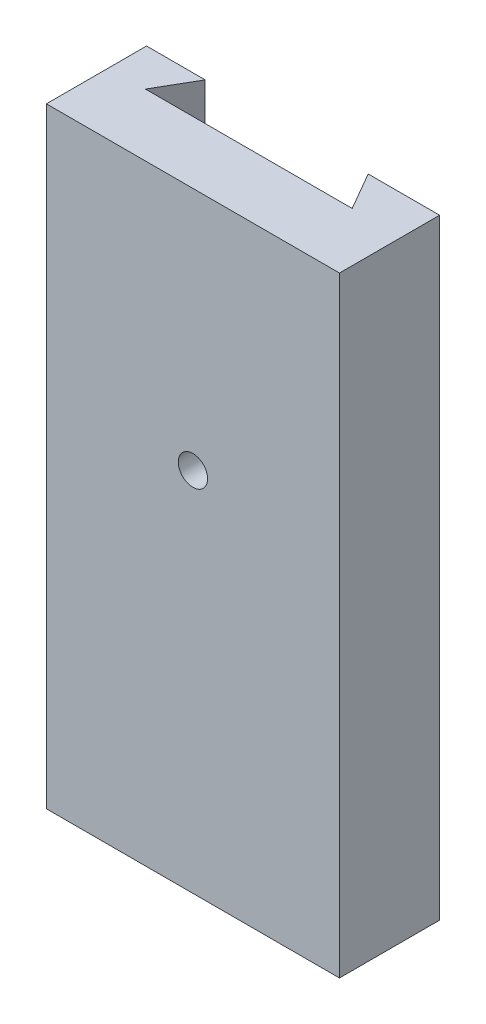
ISO-10303-21;
HEADER;
FILE_DESCRIPTION(('STEP AP214'),'2;1');
FILE_NAME('part.step','',(''),(''),'','','');
FILE_SCHEMA(('AUTOMOTIVE_DESIGN { 1 0 10303 214 1 1 1 1 }'));
ENDSEC;
DATA;
#1=APPLICATION_CONTEXT('core data for automotive mechanical design processes');
#2=APPLICATION_PROTOCOL_DEFINITION('international standard','automotive_design',2000,#1);
#3=PRODUCT_CONTEXT('',#1,'mechanical');
#4=PRODUCT('Part','Part','',(#3));
#5=PRODUCT_RELATED_PRODUCT_CATEGORY('part','',(#4));
#6=PRODUCT_DEFINITION_FORMATION('','',#4);
#7=PRODUCT_DEFINITION_CONTEXT('part definition',#1,'design');
#8=PRODUCT_DEFINITION('design','',#6,#7);
#9=PRODUCT_DEFINITION_SHAPE('','',#8);
#10=(LENGTH_UNIT() NAMED_UNIT(*) SI_UNIT(.MILLI.,.METRE.));
#11=(NAMED_UNIT(*) PLANE_ANGLE_UNIT() SI_UNIT($,.RADIAN.));
#12=(NAMED_UNIT(*) SI_UNIT($,.STERADIAN.) SOLID_ANGLE_UNIT());
#13=UNCERTAINTY_MEASURE_WITH_UNIT(LENGTH_MEASURE(1.E-05),#10,'distance_accuracy_value','');
#14=(GEOMETRIC_REPRESENTATION_CONTEXT(3) GLOBAL_UNCERTAINTY_ASSIGNED_CONTEXT((#13)) GLOBAL_UNIT_ASSIGNED_CONTEXT((#10,
#11,#12)) REPRESENTATION_CONTEXT('',''));
#15=CARTESIAN_POINT('',(0.,0.,0.));
#16=DIRECTION('',(0.,0.,1.));
#17=DIRECTION('',(1.,0.,0.));
#18=AXIS2_PLACEMENT_3D('',#15,#16,#17);
#19=CARTESIAN_POINT('',(-60.,250.,-20.5));
#20=DIRECTION('',(0.,0.,1.));
#21=DIRECTION('',(1.,0.,0.));
#22=AXIS2_PLACEMENT_3D('',#19,#20,#21);
#23=PLANE('',#22);
#24=DIRECTION('',(-1.,0.,0.));
#25=VECTOR('',#24,1.);
#26=CARTESIAN_POINT('',(-60.,0.,-20.5));
#27=LINE('',#26,#25);
#28=CARTESIAN_POINT('',(60.,0.,-20.5));
#29=VERTEX_POINT('',#28);
#30=CARTESIAN_POINT('',(30.76,0.,-20.5));
#31=VERTEX_POINT('',#30);
#32=EDGE_CURVE('E139',#29,#31,#27,.T.);
#33=ORIENTED_EDGE('',*,*,#32,.T.);
#34=DIRECTION('',(0.,1.,0.));
#35=VECTOR('',#34,1.);
#36=CARTESIAN_POINT('',(30.76,0.,-20.5));
#37=LINE('',#36,#35);
#38=CARTESIAN_POINT('',(30.76,250.,-20.5));
#39=VERTEX_POINT('',#38);
#40=EDGE_CURVE('E144',#31,#39,#37,.T.);
#41=ORIENTED_EDGE('',*,*,#40,.T.);
#42=DIRECTION('',(-1.,0.,0.));
#43=VECTOR('',#42,1.);
#44=CARTESIAN_POINT('',(-60.,250.,-20.5));
#45=LINE('',#44,#43);
#46=CARTESIAN_POINT('',(60.,250.,-20.5));
#47=VERTEX_POINT('',#46);
#48=EDGE_CURVE('E93',#47,#39,#45,.T.);
#49=ORIENTED_EDGE('',*,*,#48,.F.);
#50=DIRECTION('',(0.,-1.,0.));
#51=VECTOR('',#50,1.);
#52=CARTESIAN_POINT('',(60.,250.,-20.5));
#53=LINE('',#52,#51);
#54=EDGE_CURVE('E11',#47,#29,#53,.T.);
#55=ORIENTED_EDGE('',*,*,#54,.T.);
#56=EDGE_LOOP('',(#33,#41,#49,#55));
#57=FACE_BOUND('',#56,.T.);
#58=ADVANCED_FACE('F40',(#57),#23,.F.);
#59=CARTESIAN_POINT('',(60.,250.,20.5));
#60=DIRECTION('',(-1.,0.,0.));
#61=DIRECTION('',(0.,0.,1.));
#62=AXIS2_PLACEMENT_3D('',#59,#60,#61);
#63=PLANE('',#62);
#64=DIRECTION('',(0.,0.,-1.));
#65=VECTOR('',#64,1.);
#66=CARTESIAN_POINT('',(60.,0.,20.5));
#67=LINE('',#66,#65);
#68=CARTESIAN_POINT('',(60.,0.,20.5));
#69=VERTEX_POINT('',#68);
#70=EDGE_CURVE('E140',#69,#29,#67,.T.);
#71=ORIENTED_EDGE('',*,*,#70,.T.);
#72=ORIENTED_EDGE('',*,*,#54,.F.);
#73=DIRECTION('',(0.,0.,-1.));
#74=VECTOR('',#73,1.);
#75=CARTESIAN_POINT('',(60.,250.,20.5));
#76=LINE('',#75,#74);
#77=CARTESIAN_POINT('',(60.,250.,20.5));
#78=VERTEX_POINT('',#77);
#79=EDGE_CURVE('E150',#78,#47,#76,.T.);
#80=ORIENTED_EDGE('',*,*,#79,.F.);
#81=DIRECTION('',(0.,-1.,0.));
#82=VECTOR('',#81,1.);
#83=CARTESIAN_POINT('',(60.,250.,20.5));
#84=LINE('',#83,#82);
#85=EDGE_CURVE('E151',#78,#69,#84,.T.);
#86=ORIENTED_EDGE('',*,*,#85,.T.);
#87=EDGE_LOOP('',(#71,#72,#80,#86));
#88=FACE_BOUND('',#87,.T.);
#89=ADVANCED_FACE('F42',(#88),#63,.F.);
#90=CARTESIAN_POINT('',(-36.,250.,-20.5));
#91=VERTEX_POINT('',#90);
#92=CARTESIAN_POINT('',(-60.,250.,-20.5));
#93=VERTEX_POINT('',#92);
#94=EDGE_CURVE('E132',#91,#93,#45,.T.);
#95=ORIENTED_EDGE('',*,*,#94,.F.);
#96=DIRECTION('',(0.,1.,0.));
#97=VECTOR('',#96,1.);
#98=CARTESIAN_POINT('',(-36.,0.,-20.5));
#99=LINE('',#98,#97);
#100=CARTESIAN_POINT('',(-36.,0.,-20.5));
#101=VERTEX_POINT('',#100);
#102=EDGE_CURVE('E119',#101,#91,#99,.T.);
#103=ORIENTED_EDGE('',*,*,#102,.F.);
#104=CARTESIAN_POINT('',(-60.,0.,-20.5));
#105=VERTEX_POINT('',#104);
#106=EDGE_CURVE('E130',#101,#105,#27,.T.);
#107=ORIENTED_EDGE('',*,*,#106,.T.);
#108=DIRECTION('',(0.,-1.,0.));
#109=VECTOR('',#108,1.);
#110=CARTESIAN_POINT('',(-60.,250.,-20.5));
#111=LINE('',#110,#109);
#112=EDGE_CURVE('E49',#93,#105,#111,.T.);
#113=ORIENTED_EDGE('',*,*,#112,.F.);
#114=EDGE_LOOP('',(#95,#103,#107,#113));
#115=FACE_BOUND('',#114,.T.);
#116=ADVANCED_FACE('F128',(#115),#23,.F.);
#117=CARTESIAN_POINT('',(-60.,250.,20.5));
#118=DIRECTION('',(1.,0.,0.));
#119=DIRECTION('',(0.,0.,-1.));
#120=AXIS2_PLACEMENT_3D('',#117,#118,#119);
#121=PLANE('',#120);
#122=DIRECTION('',(0.,0.,1.));
#123=VECTOR('',#122,1.);
#124=CARTESIAN_POINT('',(-60.,0.,20.5));
#125=LINE('',#124,#123);
#126=CARTESIAN_POINT('',(-60.,0.,20.5));
#127=VERTEX_POINT('',#126);
#128=EDGE_CURVE('E138',#105,#127,#125,.T.);
#129=ORIENTED_EDGE('',*,*,#128,.T.);
#130=DIRECTION('',(0.,-1.,0.));
#131=VECTOR('',#130,1.);
#132=CARTESIAN_POINT('',(-60.,250.,20.5));
#133=LINE('',#132,#131);
#134=CARTESIAN_POINT('',(-60.,250.,20.5));
#135=VERTEX_POINT('',#134);
#136=EDGE_CURVE('E153',#135,#127,#133,.T.);
#137=ORIENTED_EDGE('',*,*,#136,.F.);
#138=DIRECTION('',(0.,0.,1.));
#139=VECTOR('',#138,1.);
#140=CARTESIAN_POINT('',(-60.,250.,20.5));
#141=LINE('',#140,#139);
#142=EDGE_CURVE('E159',#93,#135,#141,.T.);
#143=ORIENTED_EDGE('',*,*,#142,.F.);
#144=ORIENTED_EDGE('',*,*,#112,.T.);
#145=EDGE_LOOP('',(#129,#137,#143,#144));
#146=FACE_BOUND('',#145,.T.);
#147=ADVANCED_FACE('F157',(#146),#121,.F.);
#148=CARTESIAN_POINT('',(-60.,250.,20.5));
#149=DIRECTION('',(0.,0.,-1.));
#150=DIRECTION('',(-1.,0.,0.));
#151=AXIS2_PLACEMENT_3D('',#148,#149,#150);
#152=PLANE('',#151);
#153=CARTESIAN_POINT('',(0.,150.,20.5));
#154=DIRECTION('',(0.,0.,1.));
#155=DIRECTION('',(1.,0.,0.));
#156=AXIS2_PLACEMENT_3D('',#153,#154,#155);
#157=CIRCLE('',#156,6.);
#158=CARTESIAN_POINT('',(6.,150.,20.5));
#159=VERTEX_POINT('',#158);
#160=EDGE_CURVE('E176',#159,#159,#157,.T.);
#161=ORIENTED_EDGE('',*,*,#160,.F.);
#162=EDGE_LOOP('',(#161));
#163=FACE_BOUND('',#162,.T.);
#164=DIRECTION('',(1.,0.,0.));
#165=VECTOR('',#164,1.);
#166=CARTESIAN_POINT('',(-60.,0.,20.5));
#167=LINE('',#166,#165);
#168=EDGE_CURVE('E86',#127,#69,#167,.T.);
#169=ORIENTED_EDGE('',*,*,#168,.T.);
#170=ORIENTED_EDGE('',*,*,#85,.F.);
#171=DIRECTION('',(1.,0.,0.));
#172=VECTOR('',#171,1.);
#173=CARTESIAN_POINT('',(-60.,250.,20.5));
#174=LINE('',#173,#172);
#175=EDGE_CURVE('E65',#135,#78,#174,.T.);
#176=ORIENTED_EDGE('',*,*,#175,.F.);
#177=ORIENTED_EDGE('',*,*,#136,.T.);
#178=EDGE_LOOP('',(#169,#170,#176,#177));
#179=FACE_BOUND('',#178,.T.);
#180=ADVANCED_FACE('F203',(#163,#179),#152,.F.);
#181=CARTESIAN_POINT('',(0.,250.,0.));
#182=DIRECTION('',(0.,-1.,0.));
#183=DIRECTION('',(0.,0.,-1.));
#184=AXIS2_PLACEMENT_3D('',#181,#182,#183);
#185=PLANE('',#184);
#186=ORIENTED_EDGE('',*,*,#48,.T.);
#187=DIRECTION('',(-0.500000000000004,0.,-0.866025403784436));
#188=VECTOR('',#187,1.);
#189=CARTESIAN_POINT('',(30.76,250.,-20.5));
#190=LINE('',#189,#188);
#191=CARTESIAN_POINT('',(39.7089291724393,250.,-5.));
#192=VERTEX_POINT('',#191);
#193=EDGE_CURVE('E124',#192,#39,#190,.T.);
#194=ORIENTED_EDGE('',*,*,#193,.F.);
#195=DIRECTION('',(1.,0.,0.));
#196=VECTOR('',#195,1.);
#197=CARTESIAN_POINT('',(-44.9489291724391,250.,-5.));
#198=LINE('',#197,#196);
#199=CARTESIAN_POINT('',(-44.9489291724391,250.,-5.));
#200=VERTEX_POINT('',#199);
#201=EDGE_CURVE('E169',#200,#192,#198,.T.);
#202=ORIENTED_EDGE('',*,*,#201,.F.);
#203=DIRECTION('',(-0.499999999999998,0.,0.86602540378444));
#204=VECTOR('',#203,1.);
#205=CARTESIAN_POINT('',(-36.,250.,-20.5));
#206=LINE('',#205,#204);
#207=EDGE_CURVE('E172',#91,#200,#206,.T.);
#208=ORIENTED_EDGE('',*,*,#207,.F.);
#209=ORIENTED_EDGE('',*,*,#94,.T.);
#210=ORIENTED_EDGE('',*,*,#142,.T.);
#211=ORIENTED_EDGE('',*,*,#175,.T.);
#212=ORIENTED_EDGE('',*,*,#79,.T.);
#213=EDGE_LOOP('',(#186,#194,#202,#208,#209,#210,#211,#212));
#214=FACE_BOUND('',#213,.T.);
#215=ADVANCED_FACE('F207',(#214),#185,.F.);
#216=CARTESIAN_POINT('',(0.,0.,0.));
#217=DIRECTION('',(0.,-1.,0.));
#218=DIRECTION('',(0.,0.,-1.));
#219=AXIS2_PLACEMENT_3D('',#216,#217,#218);
#220=PLANE('',#219);
#221=DIRECTION('',(-0.500000000000004,0.,-0.866025403784436));
#222=VECTOR('',#221,1.);
#223=CARTESIAN_POINT('',(30.76,0.,-20.5));
#224=LINE('',#223,#222);
#225=CARTESIAN_POINT('',(39.7089291724393,0.,-5.));
#226=VERTEX_POINT('',#225);
#227=EDGE_CURVE('E133',#226,#31,#224,.T.);
#228=ORIENTED_EDGE('',*,*,#227,.T.);
#229=ORIENTED_EDGE('',*,*,#32,.F.);
#230=ORIENTED_EDGE('',*,*,#70,.F.);
#231=ORIENTED_EDGE('',*,*,#168,.F.);
#232=ORIENTED_EDGE('',*,*,#128,.F.);
#233=ORIENTED_EDGE('',*,*,#106,.F.);
#234=DIRECTION('',(-0.499999999999998,0.,0.86602540378444));
#235=VECTOR('',#234,1.);
#236=CARTESIAN_POINT('',(-36.,0.,-20.5));
#237=LINE('',#236,#235);
#238=CARTESIAN_POINT('',(-44.9489291724391,0.,-5.));
#239=VERTEX_POINT('',#238);
#240=EDGE_CURVE('E115',#101,#239,#237,.T.);
#241=ORIENTED_EDGE('',*,*,#240,.T.);
#242=DIRECTION('',(1.,0.,0.));
#243=VECTOR('',#242,1.);
#244=CARTESIAN_POINT('',(-44.9489291724391,0.,-5.));
#245=LINE('',#244,#243);
#246=EDGE_CURVE('E56',#239,#226,#245,.T.);
#247=ORIENTED_EDGE('',*,*,#246,.T.);
#248=EDGE_LOOP('',(#228,#229,#230,#231,#232,#233,#241,#247));
#249=FACE_BOUND('',#248,.T.);
#250=ADVANCED_FACE('F137',(#249),#220,.T.);
#251=CARTESIAN_POINT('',(30.76,0.,-20.5));
#252=DIRECTION('',(0.866025403784436,0.,-0.500000000000004));
#253=DIRECTION('',(-0.500000000000004,0.,-0.866025403784436));
#254=AXIS2_PLACEMENT_3D('',#251,#252,#253);
#255=PLANE('',#254);
#256=ORIENTED_EDGE('',*,*,#193,.T.);
#257=ORIENTED_EDGE('',*,*,#40,.F.);
#258=ORIENTED_EDGE('',*,*,#227,.F.);
#259=DIRECTION('',(0.,1.,0.));
#260=VECTOR('',#259,1.);
#261=CARTESIAN_POINT('',(39.7089291724393,0.,-5.));
#262=LINE('',#261,#260);
#263=EDGE_CURVE('E165',#226,#192,#262,.T.);
#264=ORIENTED_EDGE('',*,*,#263,.T.);
#265=EDGE_LOOP('',(#256,#257,#258,#264));
#266=FACE_BOUND('',#265,.T.);
#267=ADVANCED_FACE('F213',(#266),#255,.F.);
#268=CARTESIAN_POINT('',(-44.9489291724391,0.,-5.));
#269=DIRECTION('',(0.,0.,1.));
#270=DIRECTION('',(1.,0.,0.));
#271=AXIS2_PLACEMENT_3D('',#268,#269,#270);
#272=PLANE('',#271);
#273=CARTESIAN_POINT('',(0.,150.,-5.));
#274=DIRECTION('',(0.,0.,1.));
#275=DIRECTION('',(1.,0.,0.));
#276=AXIS2_PLACEMENT_3D('',#273,#274,#275);
#277=CIRCLE('',#276,6.);
#278=CARTESIAN_POINT('',(6.,150.,-5.));
#279=VERTEX_POINT('',#278);
#280=EDGE_CURVE('E44',#279,#279,#277,.T.);
#281=ORIENTED_EDGE('',*,*,#280,.T.);
#282=EDGE_LOOP('',(#281));
#283=FACE_BOUND('',#282,.T.);
#284=ORIENTED_EDGE('',*,*,#201,.T.);
#285=ORIENTED_EDGE('',*,*,#263,.F.);
#286=ORIENTED_EDGE('',*,*,#246,.F.);
#287=DIRECTION('',(0.,1.,0.));
#288=VECTOR('',#287,1.);
#289=CARTESIAN_POINT('',(-44.9489291724391,0.,-5.));
#290=LINE('',#289,#288);
#291=EDGE_CURVE('E121',#239,#200,#290,.T.);
#292=ORIENTED_EDGE('',*,*,#291,.T.);
#293=EDGE_LOOP('',(#284,#285,#286,#292));
#294=FACE_BOUND('',#293,.T.);
#295=ADVANCED_FACE('F183',(#283,#294),#272,.F.);
#296=CARTESIAN_POINT('',(-36.,0.,-20.5));
#297=DIRECTION('',(-0.86602540378444,0.,-0.499999999999998));
#298=DIRECTION('',(-0.499999999999998,0.,0.86602540378444));
#299=AXIS2_PLACEMENT_3D('',#296,#297,#298);
#300=PLANE('',#299);
#301=ORIENTED_EDGE('',*,*,#207,.T.);
#302=ORIENTED_EDGE('',*,*,#291,.F.);
#303=ORIENTED_EDGE('',*,*,#240,.F.);
#304=ORIENTED_EDGE('',*,*,#102,.T.);
#305=EDGE_LOOP('',(#301,#302,#303,#304));
#306=FACE_BOUND('',#305,.T.);
#307=ADVANCED_FACE('F118',(#306),#300,.F.);
#308=CARTESIAN_POINT('',(0.,150.,-229.5));
#309=DIRECTION('',(0.,0.,1.));
#310=DIRECTION('',(1.,0.,0.));
#311=AXIS2_PLACEMENT_3D('',#308,#309,#310);
#312=CYLINDRICAL_SURFACE('',#311,6.);
#313=ORIENTED_EDGE('',*,*,#160,.T.);
#314=EDGE_LOOP('',(#313));
#315=FACE_BOUND('',#314,.T.);
#316=ORIENTED_EDGE('',*,*,#280,.F.);
#317=EDGE_LOOP('',(#316));
#318=FACE_BOUND('',#317,.T.);
#319=ADVANCED_FACE('F185',(#315,#318),#312,.F.);
#320=CLOSED_SHELL('',(#58,#89,#116,#147,#180,#215,#250,#267,#295,#307,#319));
#321=MANIFOLD_SOLID_BREP('B2',#320);
#322=ADVANCED_BREP_SHAPE_REPRESENTATION('',(#18,#321),#14);
#323=SHAPE_DEFINITION_REPRESENTATION(#9,#322);
ENDSEC;
END-ISO-10303-21;
